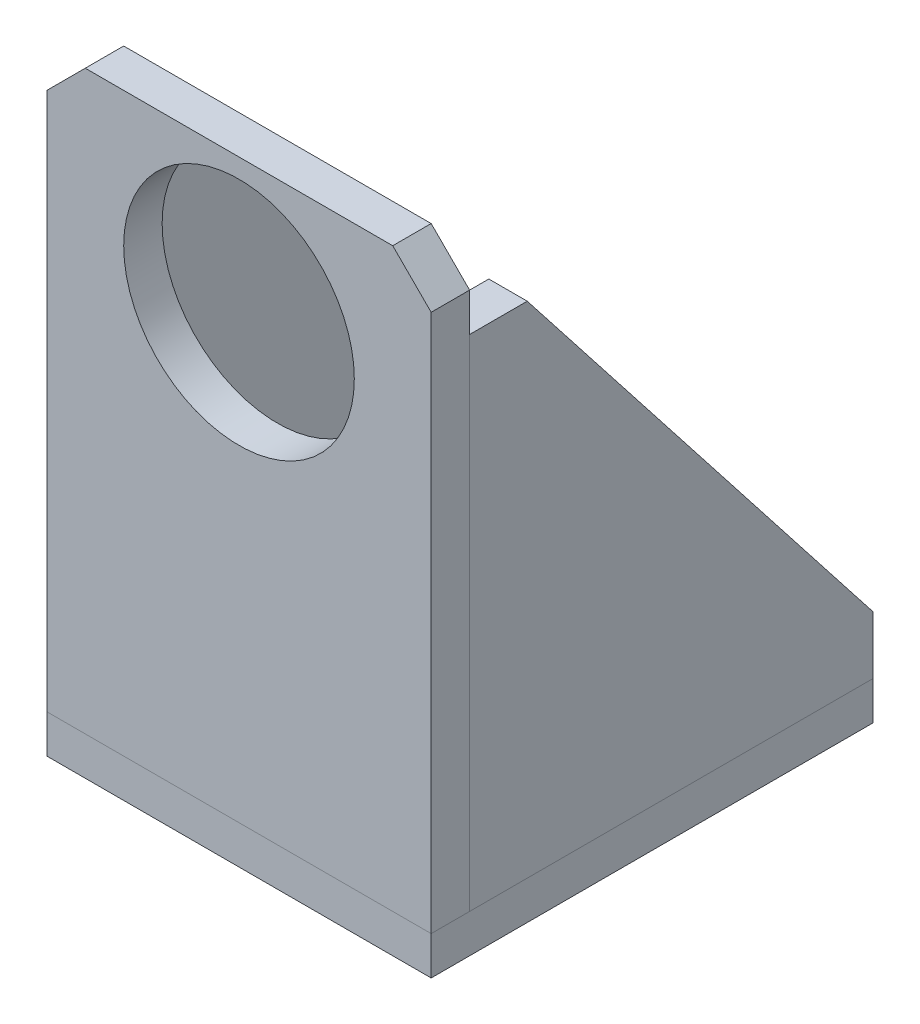
ISO-10303-21;
HEADER;
FILE_DESCRIPTION(('STEP AP214'),'2;1');
FILE_NAME('part.step','',(''),(''),'','','');
FILE_SCHEMA(('AUTOMOTIVE_DESIGN { 1 0 10303 214 1 1 1 1 }'));
ENDSEC;
DATA;
#1=APPLICATION_CONTEXT('core data for automotive mechanical design processes');
#2=APPLICATION_PROTOCOL_DEFINITION('international standard','automotive_design',2000,#1);
#3=PRODUCT_CONTEXT('',#1,'mechanical');
#4=PRODUCT('Part','Part','',(#3));
#5=PRODUCT_RELATED_PRODUCT_CATEGORY('part','',(#4));
#6=PRODUCT_DEFINITION_FORMATION('','',#4);
#7=PRODUCT_DEFINITION_CONTEXT('part definition',#1,'design');
#8=PRODUCT_DEFINITION('design','',#6,#7);
#9=PRODUCT_DEFINITION_SHAPE('','',#8);
#10=(LENGTH_UNIT() NAMED_UNIT(*) SI_UNIT(.MILLI.,.METRE.));
#11=(NAMED_UNIT(*) PLANE_ANGLE_UNIT() SI_UNIT($,.RADIAN.));
#12=(NAMED_UNIT(*) SI_UNIT($,.STERADIAN.) SOLID_ANGLE_UNIT());
#13=UNCERTAINTY_MEASURE_WITH_UNIT(LENGTH_MEASURE(1.E-05),#10,'distance_accuracy_value','');
#14=(GEOMETRIC_REPRESENTATION_CONTEXT(3) GLOBAL_UNCERTAINTY_ASSIGNED_CONTEXT((#13)) GLOBAL_UNIT_ASSIGNED_CONTEXT((#10,
#11,#12)) REPRESENTATION_CONTEXT('',''));
#15=CARTESIAN_POINT('',(0.,0.,0.));
#16=DIRECTION('',(0.,0.,1.));
#17=DIRECTION('',(1.,0.,0.));
#18=AXIS2_PLACEMENT_3D('',#15,#16,#17);
#19=CARTESIAN_POINT('',(-40.,130.,0.));
#20=DIRECTION('',(0.,1.,0.));
#21=DIRECTION('',(-1.,0.,0.));
#22=AXIS2_PLACEMENT_3D('',#19,#20,#21);
#23=PLANE('',#22);
#24=DIRECTION('',(0.,0.,-1.));
#25=VECTOR('',#24,1.);
#26=CARTESIAN_POINT('',(-50.,130.,0.));
#27=LINE('',#26,#25);
#28=CARTESIAN_POINT('',(-50.,130.,0.));
#29=VERTEX_POINT('',#28);
#30=CARTESIAN_POINT('',(-50.,130.,-15.));
#31=VERTEX_POINT('',#30);
#32=EDGE_CURVE('E122',#29,#31,#27,.T.);
#33=ORIENTED_EDGE('',*,*,#32,.F.);
#34=DIRECTION('',(-1.,0.,0.));
#35=VECTOR('',#34,1.);
#36=CARTESIAN_POINT('',(-40.,130.,0.));
#37=LINE('',#36,#35);
#38=CARTESIAN_POINT('',(-40.,130.,0.));
#39=VERTEX_POINT('',#38);
#40=EDGE_CURVE('E12',#39,#29,#37,.T.);
#41=ORIENTED_EDGE('',*,*,#40,.F.);
#42=DIRECTION('',(0.,0.,-1.));
#43=VECTOR('',#42,1.);
#44=CARTESIAN_POINT('',(-40.,130.,0.));
#45=LINE('',#44,#43);
#46=CARTESIAN_POINT('',(-40.,130.,-15.));
#47=VERTEX_POINT('',#46);
#48=EDGE_CURVE('E117',#39,#47,#45,.T.);
#49=ORIENTED_EDGE('',*,*,#48,.T.);
#50=DIRECTION('',(-1.,0.,0.));
#51=VECTOR('',#50,1.);
#52=CARTESIAN_POINT('',(-40.,130.,-15.));
#53=LINE('',#52,#51);
#54=EDGE_CURVE('E48',#47,#31,#53,.T.);
#55=ORIENTED_EDGE('',*,*,#54,.T.);
#56=EDGE_LOOP('',(#33,#41,#49,#55));
#57=FACE_BOUND('',#56,.T.);
#58=ADVANCED_FACE('F45',(#57),#23,.T.);
#59=CARTESIAN_POINT('',(-40.,0.,0.));
#60=DIRECTION('',(0.,0.,1.));
#61=DIRECTION('',(1.,0.,0.));
#62=AXIS2_PLACEMENT_3D('',#59,#60,#61);
#63=PLANE('',#62);
#64=DIRECTION('',(0.,1.,0.));
#65=VECTOR('',#64,1.);
#66=CARTESIAN_POINT('',(-50.,0.,0.));
#67=LINE('',#66,#65);
#68=CARTESIAN_POINT('',(-50.,0.,0.));
#69=VERTEX_POINT('',#68);
#70=EDGE_CURVE('E131',#69,#29,#67,.T.);
#71=ORIENTED_EDGE('',*,*,#70,.F.);
#72=DIRECTION('',(-1.,0.,0.));
#73=VECTOR('',#72,1.);
#74=CARTESIAN_POINT('',(-40.,0.,0.));
#75=LINE('',#74,#73);
#76=CARTESIAN_POINT('',(-40.,0.,0.));
#77=VERTEX_POINT('',#76);
#78=EDGE_CURVE('E54',#77,#69,#75,.T.);
#79=ORIENTED_EDGE('',*,*,#78,.F.);
#80=DIRECTION('',(0.,1.,0.));
#81=VECTOR('',#80,1.);
#82=CARTESIAN_POINT('',(-40.,0.,0.));
#83=LINE('',#82,#81);
#84=EDGE_CURVE('E112',#77,#39,#83,.T.);
#85=ORIENTED_EDGE('',*,*,#84,.T.);
#86=ORIENTED_EDGE('',*,*,#40,.T.);
#87=EDGE_LOOP('',(#71,#79,#85,#86));
#88=FACE_BOUND('',#87,.T.);
#89=ADVANCED_FACE('F137',(#88),#63,.T.);
#90=CARTESIAN_POINT('',(-40.,0.,-105.));
#91=DIRECTION('',(0.,-1.,0.));
#92=DIRECTION('',(1.,0.,0.));
#93=AXIS2_PLACEMENT_3D('',#90,#91,#92);
#94=PLANE('',#93);
#95=DIRECTION('',(0.,0.,1.));
#96=VECTOR('',#95,1.);
#97=CARTESIAN_POINT('',(-50.,0.,-105.));
#98=LINE('',#97,#96);
#99=CARTESIAN_POINT('',(-50.,0.,-105.));
#100=VERTEX_POINT('',#99);
#101=EDGE_CURVE('E101',#100,#69,#98,.T.);
#102=ORIENTED_EDGE('',*,*,#101,.F.);
#103=DIRECTION('',(-1.,0.,0.));
#104=VECTOR('',#103,1.);
#105=CARTESIAN_POINT('',(-40.,0.,-105.));
#106=LINE('',#105,#104);
#107=CARTESIAN_POINT('',(-40.,0.,-105.));
#108=VERTEX_POINT('',#107);
#109=EDGE_CURVE('E96',#108,#100,#106,.T.);
#110=ORIENTED_EDGE('',*,*,#109,.F.);
#111=DIRECTION('',(0.,0.,1.));
#112=VECTOR('',#111,1.);
#113=CARTESIAN_POINT('',(-40.,0.,-105.));
#114=LINE('',#113,#112);
#115=EDGE_CURVE('E99',#108,#77,#114,.T.);
#116=ORIENTED_EDGE('',*,*,#115,.T.);
#117=ORIENTED_EDGE('',*,*,#78,.T.);
#118=EDGE_LOOP('',(#102,#110,#116,#117));
#119=FACE_BOUND('',#118,.T.);
#120=ADVANCED_FACE('F98',(#119),#94,.T.);
#121=CARTESIAN_POINT('',(-40.,15.,-105.));
#122=DIRECTION('',(0.,0.,-1.));
#123=DIRECTION('',(-1.,0.,0.));
#124=AXIS2_PLACEMENT_3D('',#121,#122,#123);
#125=PLANE('',#124);
#126=DIRECTION('',(0.,-1.,0.));
#127=VECTOR('',#126,1.);
#128=CARTESIAN_POINT('',(-50.,15.,-105.));
#129=LINE('',#128,#127);
#130=CARTESIAN_POINT('',(-50.,15.,-105.));
#131=VERTEX_POINT('',#130);
#132=EDGE_CURVE('E128',#131,#100,#129,.T.);
#133=ORIENTED_EDGE('',*,*,#132,.F.);
#134=DIRECTION('',(-1.,0.,0.));
#135=VECTOR('',#134,1.);
#136=CARTESIAN_POINT('',(-40.,15.,-105.));
#137=LINE('',#136,#135);
#138=CARTESIAN_POINT('',(-40.,15.,-105.));
#139=VERTEX_POINT('',#138);
#140=EDGE_CURVE('E106',#139,#131,#137,.T.);
#141=ORIENTED_EDGE('',*,*,#140,.F.);
#142=DIRECTION('',(0.,-1.,0.));
#143=VECTOR('',#142,1.);
#144=CARTESIAN_POINT('',(-40.,15.,-105.));
#145=LINE('',#144,#143);
#146=EDGE_CURVE('E111',#139,#108,#145,.T.);
#147=ORIENTED_EDGE('',*,*,#146,.T.);
#148=ORIENTED_EDGE('',*,*,#109,.T.);
#149=EDGE_LOOP('',(#133,#141,#147,#148));
#150=FACE_BOUND('',#149,.T.);
#151=ADVANCED_FACE('F114',(#150),#125,.T.);
#152=CARTESIAN_POINT('',(-40.,130.,-15.));
#153=DIRECTION('',(0.,0.616308261658111,-0.787505001007586));
#154=DIRECTION('',(0.,0.787505001007586,0.616308261658111));
#155=AXIS2_PLACEMENT_3D('',#152,#153,#154);
#156=PLANE('',#155);
#157=DIRECTION('',(0.,-0.787505001007586,-0.616308261658111));
#158=VECTOR('',#157,1.);
#159=CARTESIAN_POINT('',(-50.,130.,-15.));
#160=LINE('',#159,#158);
#161=EDGE_CURVE('E125',#31,#131,#160,.T.);
#162=ORIENTED_EDGE('',*,*,#161,.F.);
#163=ORIENTED_EDGE('',*,*,#54,.F.);
#164=DIRECTION('',(0.,-0.787505001007586,-0.616308261658111));
#165=VECTOR('',#164,1.);
#166=CARTESIAN_POINT('',(-40.,130.,-15.));
#167=LINE('',#166,#165);
#168=EDGE_CURVE('E115',#47,#139,#167,.T.);
#169=ORIENTED_EDGE('',*,*,#168,.T.);
#170=ORIENTED_EDGE('',*,*,#140,.T.);
#171=EDGE_LOOP('',(#162,#163,#169,#170));
#172=FACE_BOUND('',#171,.T.);
#173=ADVANCED_FACE('F134',(#172),#156,.T.);
#174=CARTESIAN_POINT('',(-40.,0.,0.));
#175=DIRECTION('',(-1.,0.,0.));
#176=DIRECTION('',(0.,0.,1.));
#177=AXIS2_PLACEMENT_3D('',#174,#175,#176);
#178=PLANE('',#177);
#179=ORIENTED_EDGE('',*,*,#48,.F.);
#180=ORIENTED_EDGE('',*,*,#84,.F.);
#181=ORIENTED_EDGE('',*,*,#115,.F.);
#182=ORIENTED_EDGE('',*,*,#146,.F.);
#183=ORIENTED_EDGE('',*,*,#168,.F.);
#184=EDGE_LOOP('',(#179,#180,#181,#182,#183));
#185=FACE_BOUND('',#184,.T.);
#186=ADVANCED_FACE('F110',(#185),#178,.F.);
#187=CARTESIAN_POINT('',(-50.,0.,0.));
#188=DIRECTION('',(-1.,0.,0.));
#189=DIRECTION('',(0.,0.,1.));
#190=AXIS2_PLACEMENT_3D('',#187,#188,#189);
#191=PLANE('',#190);
#192=ORIENTED_EDGE('',*,*,#32,.T.);
#193=ORIENTED_EDGE('',*,*,#161,.T.);
#194=ORIENTED_EDGE('',*,*,#132,.T.);
#195=ORIENTED_EDGE('',*,*,#101,.T.);
#196=ORIENTED_EDGE('',*,*,#70,.T.);
#197=EDGE_LOOP('',(#192,#193,#194,#195,#196));
#198=FACE_BOUND('',#197,.T.);
#199=ADVANCED_FACE('F136',(#198),#191,.T.);
#200=CLOSED_SHELL('',(#58,#89,#120,#151,#173,#186,#199));
#201=MANIFOLD_SOLID_BREP('B2',#200);
#202=CARTESIAN_POINT('',(40.,130.,0.));
#203=DIRECTION('',(0.,1.,0.));
#204=DIRECTION('',(0.,0.,1.));
#205=AXIS2_PLACEMENT_3D('',#202,#203,#204);
#206=PLANE('',#205);
#207=DIRECTION('',(0.,0.,1.));
#208=VECTOR('',#207,1.);
#209=CARTESIAN_POINT('',(50.,130.,0.));
#210=LINE('',#209,#208);
#211=CARTESIAN_POINT('',(50.,130.,-15.));
#212=VERTEX_POINT('',#211);
#213=CARTESIAN_POINT('',(50.,130.,0.));
#214=VERTEX_POINT('',#213);
#215=EDGE_CURVE('E281',#212,#214,#210,.T.);
#216=ORIENTED_EDGE('',*,*,#215,.F.);
#217=DIRECTION('',(1.,0.,0.));
#218=VECTOR('',#217,1.);
#219=CARTESIAN_POINT('',(40.,130.,-15.));
#220=LINE('',#219,#218);
#221=CARTESIAN_POINT('',(40.,130.,-15.));
#222=VERTEX_POINT('',#221);
#223=EDGE_CURVE('E43',#222,#212,#220,.T.);
#224=ORIENTED_EDGE('',*,*,#223,.F.);
#225=DIRECTION('',(0.,0.,1.));
#226=VECTOR('',#225,1.);
#227=CARTESIAN_POINT('',(40.,130.,0.));
#228=LINE('',#227,#226);
#229=CARTESIAN_POINT('',(40.,130.,0.));
#230=VERTEX_POINT('',#229);
#231=EDGE_CURVE('E276',#222,#230,#228,.T.);
#232=ORIENTED_EDGE('',*,*,#231,.T.);
#233=DIRECTION('',(1.,0.,0.));
#234=VECTOR('',#233,1.);
#235=CARTESIAN_POINT('',(40.,130.,0.));
#236=LINE('',#235,#234);
#237=EDGE_CURVE('E207',#230,#214,#236,.T.);
#238=ORIENTED_EDGE('',*,*,#237,.T.);
#239=EDGE_LOOP('',(#216,#224,#232,#238));
#240=FACE_BOUND('',#239,.T.);
#241=ADVANCED_FACE('F204',(#240),#206,.T.);
#242=CARTESIAN_POINT('',(40.,130.,-15.));
#243=DIRECTION('',(0.,0.616308261658111,-0.787505001007586));
#244=DIRECTION('',(0.,0.787505001007586,0.616308261658111));
#245=AXIS2_PLACEMENT_3D('',#242,#243,#244);
#246=PLANE('',#245);
#247=DIRECTION('',(0.,0.787505001007586,0.616308261658111));
#248=VECTOR('',#247,1.);
#249=CARTESIAN_POINT('',(50.,130.,-15.));
#250=LINE('',#249,#248);
#251=CARTESIAN_POINT('',(50.,15.,-105.));
#252=VERTEX_POINT('',#251);
#253=EDGE_CURVE('E290',#252,#212,#250,.T.);
#254=ORIENTED_EDGE('',*,*,#253,.F.);
#255=DIRECTION('',(1.,0.,0.));
#256=VECTOR('',#255,1.);
#257=CARTESIAN_POINT('',(40.,15.,-105.));
#258=LINE('',#257,#256);
#259=CARTESIAN_POINT('',(40.,15.,-105.));
#260=VERTEX_POINT('',#259);
#261=EDGE_CURVE('E213',#260,#252,#258,.T.);
#262=ORIENTED_EDGE('',*,*,#261,.F.);
#263=DIRECTION('',(0.,0.787505001007586,0.616308261658111));
#264=VECTOR('',#263,1.);
#265=CARTESIAN_POINT('',(40.,130.,-15.));
#266=LINE('',#265,#264);
#267=EDGE_CURVE('E271',#260,#222,#266,.T.);
#268=ORIENTED_EDGE('',*,*,#267,.T.);
#269=ORIENTED_EDGE('',*,*,#223,.T.);
#270=EDGE_LOOP('',(#254,#262,#268,#269));
#271=FACE_BOUND('',#270,.T.);
#272=ADVANCED_FACE('F296',(#271),#246,.T.);
#273=CARTESIAN_POINT('',(40.,15.,-105.));
#274=DIRECTION('',(0.,0.,-1.));
#275=DIRECTION('',(-1.,0.,0.));
#276=AXIS2_PLACEMENT_3D('',#273,#274,#275);
#277=PLANE('',#276);
#278=DIRECTION('',(0.,1.,0.));
#279=VECTOR('',#278,1.);
#280=CARTESIAN_POINT('',(50.,15.,-105.));
#281=LINE('',#280,#279);
#282=CARTESIAN_POINT('',(50.,0.,-105.));
#283=VERTEX_POINT('',#282);
#284=EDGE_CURVE('E260',#283,#252,#281,.T.);
#285=ORIENTED_EDGE('',*,*,#284,.F.);
#286=DIRECTION('',(1.,0.,0.));
#287=VECTOR('',#286,1.);
#288=CARTESIAN_POINT('',(40.,0.,-105.));
#289=LINE('',#288,#287);
#290=CARTESIAN_POINT('',(40.,0.,-105.));
#291=VERTEX_POINT('',#290);
#292=EDGE_CURVE('E255',#291,#283,#289,.T.);
#293=ORIENTED_EDGE('',*,*,#292,.F.);
#294=DIRECTION('',(0.,1.,0.));
#295=VECTOR('',#294,1.);
#296=CARTESIAN_POINT('',(40.,15.,-105.));
#297=LINE('',#296,#295);
#298=EDGE_CURVE('E258',#291,#260,#297,.T.);
#299=ORIENTED_EDGE('',*,*,#298,.T.);
#300=ORIENTED_EDGE('',*,*,#261,.T.);
#301=EDGE_LOOP('',(#285,#293,#299,#300));
#302=FACE_BOUND('',#301,.T.);
#303=ADVANCED_FACE('F257',(#302),#277,.T.);
#304=CARTESIAN_POINT('',(40.,0.,-105.));
#305=DIRECTION('',(0.,-1.,0.));
#306=DIRECTION('',(0.,0.,-1.));
#307=AXIS2_PLACEMENT_3D('',#304,#305,#306);
#308=PLANE('',#307);
#309=DIRECTION('',(0.,0.,-1.));
#310=VECTOR('',#309,1.);
#311=CARTESIAN_POINT('',(50.,0.,-105.));
#312=LINE('',#311,#310);
#313=CARTESIAN_POINT('',(50.,0.,0.));
#314=VERTEX_POINT('',#313);
#315=EDGE_CURVE('E287',#314,#283,#312,.T.);
#316=ORIENTED_EDGE('',*,*,#315,.F.);
#317=DIRECTION('',(1.,0.,0.));
#318=VECTOR('',#317,1.);
#319=CARTESIAN_POINT('',(40.,0.,0.));
#320=LINE('',#319,#318);
#321=CARTESIAN_POINT('',(40.,0.,0.));
#322=VERTEX_POINT('',#321);
#323=EDGE_CURVE('E265',#322,#314,#320,.T.);
#324=ORIENTED_EDGE('',*,*,#323,.F.);
#325=DIRECTION('',(0.,0.,-1.));
#326=VECTOR('',#325,1.);
#327=CARTESIAN_POINT('',(40.,0.,-105.));
#328=LINE('',#327,#326);
#329=EDGE_CURVE('E270',#322,#291,#328,.T.);
#330=ORIENTED_EDGE('',*,*,#329,.T.);
#331=ORIENTED_EDGE('',*,*,#292,.T.);
#332=EDGE_LOOP('',(#316,#324,#330,#331));
#333=FACE_BOUND('',#332,.T.);
#334=ADVANCED_FACE('F273',(#333),#308,.T.);
#335=CARTESIAN_POINT('',(40.,0.,0.));
#336=DIRECTION('',(0.,0.,1.));
#337=DIRECTION('',(1.,0.,0.));
#338=AXIS2_PLACEMENT_3D('',#335,#336,#337);
#339=PLANE('',#338);
#340=DIRECTION('',(0.,-1.,0.));
#341=VECTOR('',#340,1.);
#342=CARTESIAN_POINT('',(50.,0.,0.));
#343=LINE('',#342,#341);
#344=EDGE_CURVE('E284',#214,#314,#343,.T.);
#345=ORIENTED_EDGE('',*,*,#344,.F.);
#346=ORIENTED_EDGE('',*,*,#237,.F.);
#347=DIRECTION('',(0.,-1.,0.));
#348=VECTOR('',#347,1.);
#349=CARTESIAN_POINT('',(40.,0.,0.));
#350=LINE('',#349,#348);
#351=EDGE_CURVE('E274',#230,#322,#350,.T.);
#352=ORIENTED_EDGE('',*,*,#351,.T.);
#353=ORIENTED_EDGE('',*,*,#323,.T.);
#354=EDGE_LOOP('',(#345,#346,#352,#353));
#355=FACE_BOUND('',#354,.T.);
#356=ADVANCED_FACE('F293',(#355),#339,.T.);
#357=CARTESIAN_POINT('',(40.,0.,0.));
#358=DIRECTION('',(-1.,0.,0.));
#359=DIRECTION('',(0.,0.,1.));
#360=AXIS2_PLACEMENT_3D('',#357,#358,#359);
#361=PLANE('',#360);
#362=ORIENTED_EDGE('',*,*,#231,.F.);
#363=ORIENTED_EDGE('',*,*,#267,.F.);
#364=ORIENTED_EDGE('',*,*,#298,.F.);
#365=ORIENTED_EDGE('',*,*,#329,.F.);
#366=ORIENTED_EDGE('',*,*,#351,.F.);
#367=EDGE_LOOP('',(#362,#363,#364,#365,#366));
#368=FACE_BOUND('',#367,.T.);
#369=ADVANCED_FACE('F269',(#368),#361,.T.);
#370=CARTESIAN_POINT('',(50.,0.,0.));
#371=DIRECTION('',(-1.,0.,0.));
#372=DIRECTION('',(0.,0.,1.));
#373=AXIS2_PLACEMENT_3D('',#370,#371,#372);
#374=PLANE('',#373);
#375=ORIENTED_EDGE('',*,*,#215,.T.);
#376=ORIENTED_EDGE('',*,*,#344,.T.);
#377=ORIENTED_EDGE('',*,*,#315,.T.);
#378=ORIENTED_EDGE('',*,*,#284,.T.);
#379=ORIENTED_EDGE('',*,*,#253,.T.);
#380=EDGE_LOOP('',(#375,#376,#377,#378,#379));
#381=FACE_BOUND('',#380,.T.);
#382=ADVANCED_FACE('F295',(#381),#374,.F.);
#383=CLOSED_SHELL('',(#241,#272,#303,#334,#356,#369,#382));
#384=MANIFOLD_SOLID_BREP('B6',#383);
#385=CARTESIAN_POINT('',(50.,-9.99999999999999,10.));
#386=DIRECTION('',(-1.,0.,0.));
#387=DIRECTION('',(0.,0.,1.));
#388=AXIS2_PLACEMENT_3D('',#385,#386,#387);
#389=PLANE('',#388);
#390=DIRECTION('',(0.,0.,1.));
#391=VECTOR('',#390,1.);
#392=CARTESIAN_POINT('',(50.,0.,10.));
#393=LINE('',#392,#391);
#394=CARTESIAN_POINT('',(50.,0.,-105.));
#395=VERTEX_POINT('',#394);
#396=CARTESIAN_POINT('',(50.,0.,10.));
#397=VERTEX_POINT('',#396);
#398=EDGE_CURVE('E425',#395,#397,#393,.T.);
#399=ORIENTED_EDGE('',*,*,#398,.T.);
#400=DIRECTION('',(0.,1.,0.));
#401=VECTOR('',#400,1.);
#402=CARTESIAN_POINT('',(50.,-9.99999999999999,10.));
#403=LINE('',#402,#401);
#404=CARTESIAN_POINT('',(50.,-9.99999999999999,10.));
#405=VERTEX_POINT('',#404);
#406=EDGE_CURVE('E202',#405,#397,#403,.T.);
#407=ORIENTED_EDGE('',*,*,#406,.F.);
#408=DIRECTION('',(0.,0.,1.));
#409=VECTOR('',#408,1.);
#410=CARTESIAN_POINT('',(50.,-9.99999999999999,10.));
#411=LINE('',#410,#409);
#412=CARTESIAN_POINT('',(50.,-9.99999999999999,-105.));
#413=VERTEX_POINT('',#412);
#414=EDGE_CURVE('E413',#413,#405,#411,.T.);
#415=ORIENTED_EDGE('',*,*,#414,.F.);
#416=DIRECTION('',(0.,1.,0.));
#417=VECTOR('',#416,1.);
#418=CARTESIAN_POINT('',(50.,-9.99999999999999,-105.));
#419=LINE('',#418,#417);
#420=EDGE_CURVE('E421',#413,#395,#419,.T.);
#421=ORIENTED_EDGE('',*,*,#420,.T.);
#422=EDGE_LOOP('',(#399,#407,#415,#421));
#423=FACE_BOUND('',#422,.T.);
#424=ADVANCED_FACE('F362',(#423),#389,.F.);
#425=CARTESIAN_POINT('',(50.,-9.99999999999999,10.));
#426=DIRECTION('',(0.,0.,-1.));
#427=DIRECTION('',(-1.,0.,0.));
#428=AXIS2_PLACEMENT_3D('',#425,#426,#427);
#429=PLANE('',#428);
#430=DIRECTION('',(-1.,0.,0.));
#431=VECTOR('',#430,1.);
#432=CARTESIAN_POINT('',(50.,0.,10.));
#433=LINE('',#432,#431);
#434=CARTESIAN_POINT('',(-50.,0.,10.));
#435=VERTEX_POINT('',#434);
#436=EDGE_CURVE('E417',#397,#435,#433,.T.);
#437=ORIENTED_EDGE('',*,*,#436,.T.);
#438=DIRECTION('',(0.,1.,0.));
#439=VECTOR('',#438,1.);
#440=CARTESIAN_POINT('',(-50.,-10.,10.));
#441=LINE('',#440,#439);
#442=CARTESIAN_POINT('',(-50.,-10.,10.));
#443=VERTEX_POINT('',#442);
#444=EDGE_CURVE('E370',#443,#435,#441,.T.);
#445=ORIENTED_EDGE('',*,*,#444,.F.);
#446=DIRECTION('',(-1.,0.,0.));
#447=VECTOR('',#446,1.);
#448=CARTESIAN_POINT('',(50.,-9.99999999999999,10.));
#449=LINE('',#448,#447);
#450=EDGE_CURVE('E408',#405,#443,#449,.T.);
#451=ORIENTED_EDGE('',*,*,#450,.F.);
#452=ORIENTED_EDGE('',*,*,#406,.T.);
#453=EDGE_LOOP('',(#437,#445,#451,#452));
#454=FACE_BOUND('',#453,.T.);
#455=ADVANCED_FACE('F416',(#454),#429,.F.);
#456=CARTESIAN_POINT('',(-50.,-10.,10.));
#457=DIRECTION('',(1.,0.,0.));
#458=DIRECTION('',(0.,0.,-1.));
#459=AXIS2_PLACEMENT_3D('',#456,#457,#458);
#460=PLANE('',#459);
#461=DIRECTION('',(0.,0.,-1.));
#462=VECTOR('',#461,1.);
#463=CARTESIAN_POINT('',(-50.,0.,10.));
#464=LINE('',#463,#462);
#465=CARTESIAN_POINT('',(-50.,0.,-105.));
#466=VERTEX_POINT('',#465);
#467=EDGE_CURVE('E395',#435,#466,#464,.T.);
#468=ORIENTED_EDGE('',*,*,#467,.T.);
#469=DIRECTION('',(0.,1.,0.));
#470=VECTOR('',#469,1.);
#471=CARTESIAN_POINT('',(-50.,-10.,-105.));
#472=LINE('',#471,#470);
#473=CARTESIAN_POINT('',(-50.,-10.,-105.));
#474=VERTEX_POINT('',#473);
#475=EDGE_CURVE('E418',#474,#466,#472,.T.);
#476=ORIENTED_EDGE('',*,*,#475,.F.);
#477=DIRECTION('',(0.,0.,-1.));
#478=VECTOR('',#477,1.);
#479=CARTESIAN_POINT('',(-50.,-10.,10.));
#480=LINE('',#479,#478);
#481=EDGE_CURVE('E411',#443,#474,#480,.T.);
#482=ORIENTED_EDGE('',*,*,#481,.F.);
#483=ORIENTED_EDGE('',*,*,#444,.T.);
#484=EDGE_LOOP('',(#468,#476,#482,#483));
#485=FACE_BOUND('',#484,.T.);
#486=ADVANCED_FACE('F419',(#485),#460,.F.);
#487=CARTESIAN_POINT('',(50.,-9.99999999999999,-105.));
#488=DIRECTION('',(0.,0.,1.));
#489=DIRECTION('',(1.,0.,0.));
#490=AXIS2_PLACEMENT_3D('',#487,#488,#489);
#491=PLANE('',#490);
#492=DIRECTION('',(1.,0.,0.));
#493=VECTOR('',#492,1.);
#494=CARTESIAN_POINT('',(50.,0.,-105.));
#495=LINE('',#494,#493);
#496=EDGE_CURVE('E401',#466,#395,#495,.T.);
#497=ORIENTED_EDGE('',*,*,#496,.T.);
#498=ORIENTED_EDGE('',*,*,#420,.F.);
#499=DIRECTION('',(1.,0.,0.));
#500=VECTOR('',#499,1.);
#501=CARTESIAN_POINT('',(50.,-9.99999999999999,-105.));
#502=LINE('',#501,#500);
#503=EDGE_CURVE('E378',#474,#413,#502,.T.);
#504=ORIENTED_EDGE('',*,*,#503,.F.);
#505=ORIENTED_EDGE('',*,*,#475,.T.);
#506=EDGE_LOOP('',(#497,#498,#504,#505));
#507=FACE_BOUND('',#506,.T.);
#508=ADVANCED_FACE('F432',(#507),#491,.F.);
#509=CARTESIAN_POINT('',(0.,-10.,0.));
#510=DIRECTION('',(0.,1.,0.));
#511=DIRECTION('',(-1.,0.,0.));
#512=AXIS2_PLACEMENT_3D('',#509,#510,#511);
#513=PLANE('',#512);
#514=ORIENTED_EDGE('',*,*,#414,.T.);
#515=ORIENTED_EDGE('',*,*,#450,.T.);
#516=ORIENTED_EDGE('',*,*,#481,.T.);
#517=ORIENTED_EDGE('',*,*,#503,.T.);
#518=EDGE_LOOP('',(#514,#515,#516,#517));
#519=FACE_BOUND('',#518,.T.);
#520=ADVANCED_FACE('F409',(#519),#513,.F.);
#521=CARTESIAN_POINT('',(0.,0.,0.));
#522=DIRECTION('',(0.,1.,0.));
#523=DIRECTION('',(-1.,0.,0.));
#524=AXIS2_PLACEMENT_3D('',#521,#522,#523);
#525=PLANE('',#524);
#526=ORIENTED_EDGE('',*,*,#398,.F.);
#527=ORIENTED_EDGE('',*,*,#496,.F.);
#528=ORIENTED_EDGE('',*,*,#467,.F.);
#529=ORIENTED_EDGE('',*,*,#436,.F.);
#530=EDGE_LOOP('',(#526,#527,#528,#529));
#531=FACE_BOUND('',#530,.T.);
#532=ADVANCED_FACE('F435',(#531),#525,.T.);
#533=CLOSED_SHELL('',(#424,#455,#486,#508,#520,#532));
#534=MANIFOLD_SOLID_BREP('B37',#533);
#535=CARTESIAN_POINT('',(-50.,0.,10.));
#536=DIRECTION('',(1.,0.,0.));
#537=DIRECTION('',(0.,0.,-1.));
#538=AXIS2_PLACEMENT_3D('',#535,#536,#537);
#539=PLANE('',#538);
#540=DIRECTION('',(0.,-1.,0.));
#541=VECTOR('',#540,1.);
#542=CARTESIAN_POINT('',(-50.,0.,10.));
#543=LINE('',#542,#541);
#544=CARTESIAN_POINT('',(-50.,140.,10.));
#545=VERTEX_POINT('',#544);
#546=CARTESIAN_POINT('',(-50.,0.,10.));
#547=VERTEX_POINT('',#546);
#548=EDGE_CURVE('E540',#545,#547,#543,.T.);
#549=ORIENTED_EDGE('',*,*,#548,.F.);
#550=DIRECTION('',(0.,0.,-1.));
#551=VECTOR('',#550,1.);
#552=CARTESIAN_POINT('',(-50.,140.,10.));
#553=LINE('',#552,#551);
#554=CARTESIAN_POINT('',(-50.,140.,0.));
#555=VERTEX_POINT('',#554);
#556=EDGE_CURVE('E563',#545,#555,#553,.T.);
#557=ORIENTED_EDGE('',*,*,#556,.T.);
#558=DIRECTION('',(0.,-1.,0.));
#559=VECTOR('',#558,1.);
#560=CARTESIAN_POINT('',(-50.,0.,0.));
#561=LINE('',#560,#559);
#562=CARTESIAN_POINT('',(-50.,0.,0.));
#563=VERTEX_POINT('',#562);
#564=EDGE_CURVE('E561',#555,#563,#561,.T.);
#565=ORIENTED_EDGE('',*,*,#564,.T.);
#566=DIRECTION('',(0.,0.,-1.));
#567=VECTOR('',#566,1.);
#568=CARTESIAN_POINT('',(-50.,0.,10.));
#569=LINE('',#568,#567);
#570=EDGE_CURVE('E555',#547,#563,#569,.T.);
#571=ORIENTED_EDGE('',*,*,#570,.F.);
#572=EDGE_LOOP('',(#549,#557,#565,#571));
#573=FACE_BOUND('',#572,.T.);
#574=ADVANCED_FACE('F485',(#573),#539,.F.);
#575=CARTESIAN_POINT('',(-50.,0.,10.));
#576=DIRECTION('',(0.,1.,0.));
#577=DIRECTION('',(-1.,0.,0.));
#578=AXIS2_PLACEMENT_3D('',#575,#576,#577);
#579=PLANE('',#578);
#580=DIRECTION('',(1.,0.,0.));
#581=VECTOR('',#580,1.);
#582=CARTESIAN_POINT('',(-50.,0.,0.));
#583=LINE('',#582,#581);
#584=CARTESIAN_POINT('',(50.,0.,0.));
#585=VERTEX_POINT('',#584);
#586=EDGE_CURVE('E591',#563,#585,#583,.T.);
#587=ORIENTED_EDGE('',*,*,#586,.T.);
#588=DIRECTION('',(0.,0.,-1.));
#589=VECTOR('',#588,1.);
#590=CARTESIAN_POINT('',(50.,0.,10.));
#591=LINE('',#590,#589);
#592=CARTESIAN_POINT('',(50.,0.,10.));
#593=VERTEX_POINT('',#592);
#594=EDGE_CURVE('E557',#593,#585,#591,.T.);
#595=ORIENTED_EDGE('',*,*,#594,.F.);
#596=DIRECTION('',(1.,0.,0.));
#597=VECTOR('',#596,1.);
#598=CARTESIAN_POINT('',(-50.,0.,10.));
#599=LINE('',#598,#597);
#600=EDGE_CURVE('E543',#547,#593,#599,.T.);
#601=ORIENTED_EDGE('',*,*,#600,.F.);
#602=ORIENTED_EDGE('',*,*,#570,.T.);
#603=EDGE_LOOP('',(#587,#595,#601,#602));
#604=FACE_BOUND('',#603,.T.);
#605=ADVANCED_FACE('F554',(#604),#579,.F.);
#606=CARTESIAN_POINT('',(50.,0.,10.));
#607=DIRECTION('',(-1.,0.,0.));
#608=DIRECTION('',(0.,0.,1.));
#609=AXIS2_PLACEMENT_3D('',#606,#607,#608);
#610=PLANE('',#609);
#611=DIRECTION('',(0.,1.,0.));
#612=VECTOR('',#611,1.);
#613=CARTESIAN_POINT('',(50.,0.,0.));
#614=LINE('',#613,#612);
#615=CARTESIAN_POINT('',(50.,140.,0.));
#616=VERTEX_POINT('',#615);
#617=EDGE_CURVE('E589',#585,#616,#614,.T.);
#618=ORIENTED_EDGE('',*,*,#617,.T.);
#619=DIRECTION('',(0.,0.,1.));
#620=VECTOR('',#619,1.);
#621=CARTESIAN_POINT('',(50.,140.,10.));
#622=LINE('',#621,#620);
#623=CARTESIAN_POINT('',(50.,140.,10.));
#624=VERTEX_POINT('',#623);
#625=EDGE_CURVE('E360',#616,#624,#622,.T.);
#626=ORIENTED_EDGE('',*,*,#625,.T.);
#627=DIRECTION('',(0.,1.,0.));
#628=VECTOR('',#627,1.);
#629=CARTESIAN_POINT('',(50.,0.,10.));
#630=LINE('',#629,#628);
#631=EDGE_CURVE('E558',#593,#624,#630,.T.);
#632=ORIENTED_EDGE('',*,*,#631,.F.);
#633=ORIENTED_EDGE('',*,*,#594,.T.);
#634=EDGE_LOOP('',(#618,#626,#632,#633));
#635=FACE_BOUND('',#634,.T.);
#636=ADVANCED_FACE('F590',(#635),#610,.F.);
#637=CARTESIAN_POINT('',(-50.,150.,10.));
#638=DIRECTION('',(0.,-1.,0.));
#639=DIRECTION('',(0.,0.,-1.));
#640=AXIS2_PLACEMENT_3D('',#637,#638,#639);
#641=PLANE('',#640);
#642=DIRECTION('',(-1.,0.,0.));
#643=VECTOR('',#642,1.);
#644=CARTESIAN_POINT('',(-50.,150.,0.));
#645=LINE('',#644,#643);
#646=CARTESIAN_POINT('',(40.,150.,0.));
#647=VERTEX_POINT('',#646);
#648=CARTESIAN_POINT('',(-40.,150.,0.));
#649=VERTEX_POINT('',#648);
#650=EDGE_CURVE('E550',#647,#649,#645,.T.);
#651=ORIENTED_EDGE('',*,*,#650,.T.);
#652=DIRECTION('',(0.,0.,1.));
#653=VECTOR('',#652,1.);
#654=CARTESIAN_POINT('',(-40.,150.,10.));
#655=LINE('',#654,#653);
#656=CARTESIAN_POINT('',(-40.,150.,10.));
#657=VERTEX_POINT('',#656);
#658=EDGE_CURVE('E507',#649,#657,#655,.T.);
#659=ORIENTED_EDGE('',*,*,#658,.T.);
#660=DIRECTION('',(-1.,0.,0.));
#661=VECTOR('',#660,1.);
#662=CARTESIAN_POINT('',(-50.,150.,10.));
#663=LINE('',#662,#661);
#664=CARTESIAN_POINT('',(40.,150.,10.));
#665=VERTEX_POINT('',#664);
#666=EDGE_CURVE('E567',#665,#657,#663,.T.);
#667=ORIENTED_EDGE('',*,*,#666,.F.);
#668=DIRECTION('',(0.,0.,-1.));
#669=VECTOR('',#668,1.);
#670=CARTESIAN_POINT('',(40.,150.,10.));
#671=LINE('',#670,#669);
#672=EDGE_CURVE('E574',#665,#647,#671,.T.);
#673=ORIENTED_EDGE('',*,*,#672,.T.);
#674=EDGE_LOOP('',(#651,#659,#667,#673));
#675=FACE_BOUND('',#674,.T.);
#676=ADVANCED_FACE('F583',(#675),#641,.F.);
#677=CARTESIAN_POINT('',(0.,0.,10.));
#678=DIRECTION('',(0.,0.,-1.));
#679=DIRECTION('',(-1.,0.,0.));
#680=AXIS2_PLACEMENT_3D('',#677,#678,#679);
#681=PLANE('',#680);
#682=CARTESIAN_POINT('',(0.,115.,10.));
#683=DIRECTION('',(0.,0.,1.));
#684=DIRECTION('',(1.,0.,0.));
#685=AXIS2_PLACEMENT_3D('',#682,#683,#684);
#686=CIRCLE('',#685,30.);
#687=CARTESIAN_POINT('',(30.,115.,10.));
#688=VERTEX_POINT('',#687);
#689=EDGE_CURVE('E597',#688,#688,#686,.T.);
#690=ORIENTED_EDGE('',*,*,#689,.F.);
#691=EDGE_LOOP('',(#690));
#692=FACE_BOUND('',#691,.T.);
#693=ORIENTED_EDGE('',*,*,#666,.T.);
#694=DIRECTION('',(0.707106781186549,0.707106781186547,0.));
#695=VECTOR('',#694,1.);
#696=CARTESIAN_POINT('',(-50.,140.,10.));
#697=LINE('',#696,#695);
#698=EDGE_CURVE('E494',#657,#545,#697,.F.);
#699=ORIENTED_EDGE('',*,*,#698,.T.);
#700=ORIENTED_EDGE('',*,*,#548,.T.);
#701=ORIENTED_EDGE('',*,*,#600,.T.);
#702=ORIENTED_EDGE('',*,*,#631,.T.);
#703=DIRECTION('',(0.707106781186547,-0.707106781186549,0.));
#704=VECTOR('',#703,1.);
#705=CARTESIAN_POINT('',(40.,150.,10.));
#706=LINE('',#705,#704);
#707=EDGE_CURVE('E578',#624,#665,#706,.F.);
#708=ORIENTED_EDGE('',*,*,#707,.T.);
#709=EDGE_LOOP('',(#693,#699,#700,#701,#702,#708));
#710=FACE_BOUND('',#709,.T.);
#711=ADVANCED_FACE('F542',(#692,#710),#681,.F.);
#712=CARTESIAN_POINT('',(0.,0.,0.));
#713=DIRECTION('',(0.,0.,-1.));
#714=DIRECTION('',(-1.,0.,0.));
#715=AXIS2_PLACEMENT_3D('',#712,#713,#714);
#716=PLANE('',#715);
#717=CARTESIAN_POINT('',(0.,115.,0.));
#718=DIRECTION('',(0.,0.,-1.));
#719=DIRECTION('',(-1.,0.,0.));
#720=AXIS2_PLACEMENT_3D('',#717,#718,#719);
#721=CIRCLE('',#720,30.);
#722=CARTESIAN_POINT('',(-30.,115.,0.));
#723=VERTEX_POINT('',#722);
#724=EDGE_CURVE('E489',#723,#723,#721,.T.);
#725=ORIENTED_EDGE('',*,*,#724,.F.);
#726=EDGE_LOOP('',(#725));
#727=FACE_BOUND('',#726,.T.);
#728=ORIENTED_EDGE('',*,*,#564,.F.);
#729=DIRECTION('',(-0.707106781186549,-0.707106781186547,0.));
#730=VECTOR('',#729,1.);
#731=CARTESIAN_POINT('',(-94.9999999999999,95.0000000000002,0.));
#732=LINE('',#731,#730);
#733=EDGE_CURVE('E572',#555,#649,#732,.F.);
#734=ORIENTED_EDGE('',*,*,#733,.T.);
#735=ORIENTED_EDGE('',*,*,#650,.F.);
#736=DIRECTION('',(-0.707106781186547,0.707106781186549,0.));
#737=VECTOR('',#736,1.);
#738=CARTESIAN_POINT('',(95.0000000000001,94.9999999999998,0.));
#739=LINE('',#738,#737);
#740=EDGE_CURVE('E565',#647,#616,#739,.F.);
#741=ORIENTED_EDGE('',*,*,#740,.T.);
#742=ORIENTED_EDGE('',*,*,#617,.F.);
#743=ORIENTED_EDGE('',*,*,#586,.F.);
#744=EDGE_LOOP('',(#728,#734,#735,#741,#742,#743));
#745=FACE_BOUND('',#744,.T.);
#746=ADVANCED_FACE('F588',(#727,#745),#716,.T.);
#747=CARTESIAN_POINT('',(-50.,140.,10.));
#748=DIRECTION('',(0.707106781186547,-0.707106781186549,0.));
#749=DIRECTION('',(0.,0.,-1.));
#750=AXIS2_PLACEMENT_3D('',#747,#748,#749);
#751=PLANE('',#750);
#752=ORIENTED_EDGE('',*,*,#698,.F.);
#753=ORIENTED_EDGE('',*,*,#658,.F.);
#754=ORIENTED_EDGE('',*,*,#733,.F.);
#755=ORIENTED_EDGE('',*,*,#556,.F.);
#756=EDGE_LOOP('',(#752,#753,#754,#755));
#757=FACE_BOUND('',#756,.T.);
#758=ADVANCED_FACE('F607',(#757),#751,.F.);
#759=CARTESIAN_POINT('',(40.,150.,10.));
#760=DIRECTION('',(-0.707106781186549,-0.707106781186547,0.));
#761=DIRECTION('',(0.,0.,-1.));
#762=AXIS2_PLACEMENT_3D('',#759,#760,#761);
#763=PLANE('',#762);
#764=ORIENTED_EDGE('',*,*,#707,.F.);
#765=ORIENTED_EDGE('',*,*,#625,.F.);
#766=ORIENTED_EDGE('',*,*,#740,.F.);
#767=ORIENTED_EDGE('',*,*,#672,.F.);
#768=EDGE_LOOP('',(#764,#765,#766,#767));
#769=FACE_BOUND('',#768,.T.);
#770=ADVANCED_FACE('F487',(#769),#763,.F.);
#771=CARTESIAN_POINT('',(0.,115.,-40.));
#772=DIRECTION('',(0.,0.,1.));
#773=DIRECTION('',(1.,0.,0.));
#774=AXIS2_PLACEMENT_3D('',#771,#772,#773);
#775=CYLINDRICAL_SURFACE('',#774,30.);
#776=ORIENTED_EDGE('',*,*,#724,.T.);
#777=EDGE_LOOP('',(#776));
#778=FACE_BOUND('',#777,.T.);
#779=ORIENTED_EDGE('',*,*,#689,.T.);
#780=EDGE_LOOP('',(#779));
#781=FACE_BOUND('',#780,.T.);
#782=ADVANCED_FACE('F604',(#778,#781),#775,.F.);
#783=CLOSED_SHELL('',(#574,#605,#636,#676,#711,#746,#758,#770,#782));
#784=MANIFOLD_SOLID_BREP('B196',#783);
#785=ADVANCED_BREP_SHAPE_REPRESENTATION('',(#18,#201,#384,#534,#784),#14);
#786=SHAPE_DEFINITION_REPRESENTATION(#9,#785);
ENDSEC;
END-ISO-10303-21;
